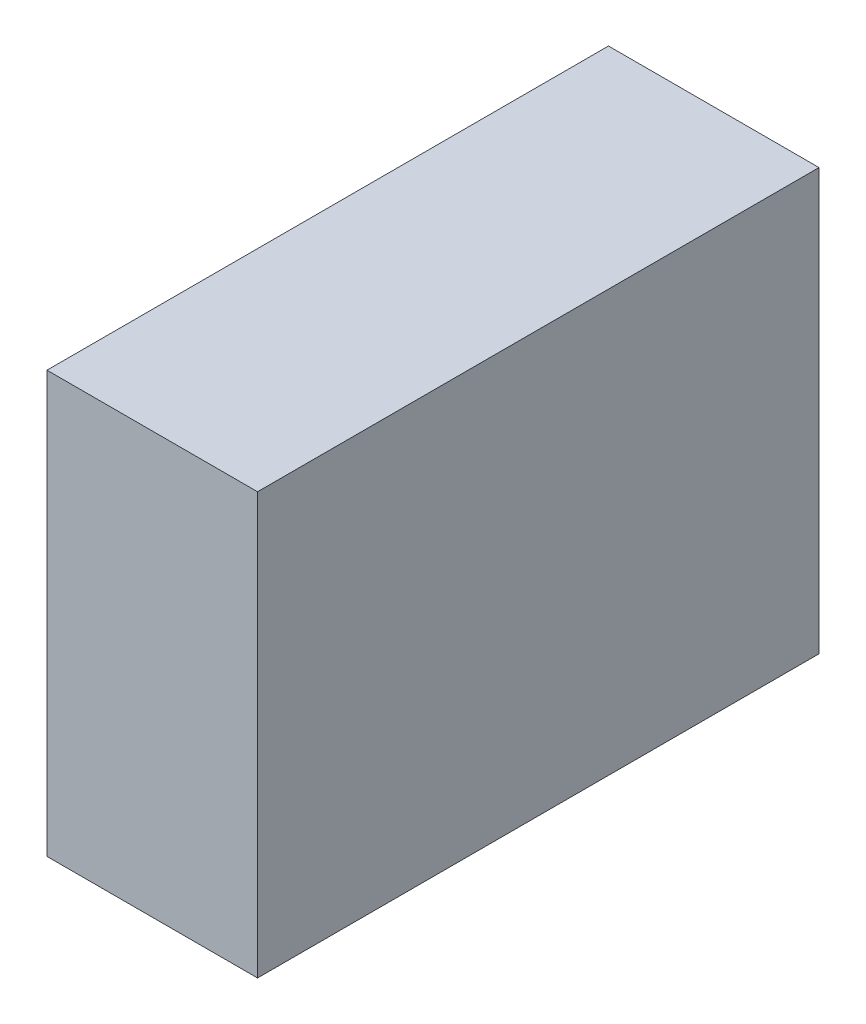
ISO-10303-21;
HEADER;
FILE_DESCRIPTION(('STEP AP214'),'2;1');
FILE_NAME('part.step','',(''),(''),'','','');
FILE_SCHEMA(('AUTOMOTIVE_DESIGN { 1 0 10303 214 1 1 1 1 }'));
ENDSEC;
DATA;
#1=APPLICATION_CONTEXT('core data for automotive mechanical design processes');
#2=APPLICATION_PROTOCOL_DEFINITION('international standard','automotive_design',2000,#1);
#3=PRODUCT_CONTEXT('',#1,'mechanical');
#4=PRODUCT('Part','Part','',(#3));
#5=PRODUCT_RELATED_PRODUCT_CATEGORY('part','',(#4));
#6=PRODUCT_DEFINITION_FORMATION('','',#4);
#7=PRODUCT_DEFINITION_CONTEXT('part definition',#1,'design');
#8=PRODUCT_DEFINITION('design','',#6,#7);
#9=PRODUCT_DEFINITION_SHAPE('','',#8);
#10=(LENGTH_UNIT() NAMED_UNIT(*) SI_UNIT(.MILLI.,.METRE.));
#11=(NAMED_UNIT(*) PLANE_ANGLE_UNIT() SI_UNIT($,.RADIAN.));
#12=(NAMED_UNIT(*) SI_UNIT($,.STERADIAN.) SOLID_ANGLE_UNIT());
#13=UNCERTAINTY_MEASURE_WITH_UNIT(LENGTH_MEASURE(1.E-05),#10,'distance_accuracy_value','');
#14=(GEOMETRIC_REPRESENTATION_CONTEXT(3) GLOBAL_UNCERTAINTY_ASSIGNED_CONTEXT((#13)) GLOBAL_UNIT_ASSIGNED_CONTEXT((#10,
#11,#12)) REPRESENTATION_CONTEXT('',''));
#15=CARTESIAN_POINT('',(0.,0.,0.));
#16=DIRECTION('',(0.,0.,1.));
#17=DIRECTION('',(1.,0.,0.));
#18=AXIS2_PLACEMENT_3D('',#15,#16,#17);
#19=CARTESIAN_POINT('',(0.,0.,152.4));
#20=DIRECTION('',(1.,0.,0.));
#21=DIRECTION('',(0.,1.,0.));
#22=AXIS2_PLACEMENT_3D('',#19,#20,#21);
#23=PLANE('',#22);
#24=DIRECTION('',(0.,-1.,0.));
#25=VECTOR('',#24,1.);
#26=CARTESIAN_POINT('',(0.,0.,0.));
#27=LINE('',#26,#25);
#28=CARTESIAN_POINT('',(0.,114.3,0.));
#29=VERTEX_POINT('',#28);
#30=CARTESIAN_POINT('',(0.,0.,0.));
#31=VERTEX_POINT('',#30);
#32=EDGE_CURVE('E100',#29,#31,#27,.T.);
#33=ORIENTED_EDGE('',*,*,#32,.T.);
#34=DIRECTION('',(0.,0.,-1.));
#35=VECTOR('',#34,1.);
#36=CARTESIAN_POINT('',(0.,0.,152.4));
#37=LINE('',#36,#35);
#38=CARTESIAN_POINT('',(0.,0.,152.4));
#39=VERTEX_POINT('',#38);
#40=EDGE_CURVE('E11',#39,#31,#37,.T.);
#41=ORIENTED_EDGE('',*,*,#40,.F.);
#42=DIRECTION('',(0.,-1.,0.));
#43=VECTOR('',#42,1.);
#44=CARTESIAN_POINT('',(0.,0.,152.4));
#45=LINE('',#44,#43);
#46=CARTESIAN_POINT('',(0.,114.3,152.4));
#47=VERTEX_POINT('',#46);
#48=EDGE_CURVE('E88',#47,#39,#45,.T.);
#49=ORIENTED_EDGE('',*,*,#48,.F.);
#50=DIRECTION('',(0.,0.,-1.));
#51=VECTOR('',#50,1.);
#52=CARTESIAN_POINT('',(0.,114.3,152.4));
#53=LINE('',#52,#51);
#54=EDGE_CURVE('E96',#47,#29,#53,.T.);
#55=ORIENTED_EDGE('',*,*,#54,.T.);
#56=EDGE_LOOP('',(#33,#41,#49,#55));
#57=FACE_BOUND('',#56,.T.);
#58=ADVANCED_FACE('F37',(#57),#23,.F.);
#59=CARTESIAN_POINT('',(0.,0.,152.4));
#60=DIRECTION('',(0.,1.,0.));
#61=DIRECTION('',(0.,0.,1.));
#62=AXIS2_PLACEMENT_3D('',#59,#60,#61);
#63=PLANE('',#62);
#64=DIRECTION('',(1.,0.,0.));
#65=VECTOR('',#64,1.);
#66=CARTESIAN_POINT('',(0.,0.,0.));
#67=LINE('',#66,#65);
#68=CARTESIAN_POINT('',(57.15,0.,0.));
#69=VERTEX_POINT('',#68);
#70=EDGE_CURVE('E92',#31,#69,#67,.T.);
#71=ORIENTED_EDGE('',*,*,#70,.T.);
#72=DIRECTION('',(0.,0.,-1.));
#73=VECTOR('',#72,1.);
#74=CARTESIAN_POINT('',(57.15,0.,152.4));
#75=LINE('',#74,#73);
#76=CARTESIAN_POINT('',(57.15,0.,152.4));
#77=VERTEX_POINT('',#76);
#78=EDGE_CURVE('E45',#77,#69,#75,.T.);
#79=ORIENTED_EDGE('',*,*,#78,.F.);
#80=DIRECTION('',(1.,0.,0.));
#81=VECTOR('',#80,1.);
#82=CARTESIAN_POINT('',(0.,0.,152.4));
#83=LINE('',#82,#81);
#84=EDGE_CURVE('E83',#39,#77,#83,.T.);
#85=ORIENTED_EDGE('',*,*,#84,.F.);
#86=ORIENTED_EDGE('',*,*,#40,.T.);
#87=EDGE_LOOP('',(#71,#79,#85,#86));
#88=FACE_BOUND('',#87,.T.);
#89=ADVANCED_FACE('F91',(#88),#63,.F.);
#90=CARTESIAN_POINT('',(57.15,0.,152.4));
#91=DIRECTION('',(-1.,0.,0.));
#92=DIRECTION('',(0.,-1.,0.));
#93=AXIS2_PLACEMENT_3D('',#90,#91,#92);
#94=PLANE('',#93);
#95=DIRECTION('',(0.,1.,0.));
#96=VECTOR('',#95,1.);
#97=CARTESIAN_POINT('',(57.15,0.,0.));
#98=LINE('',#97,#96);
#99=CARTESIAN_POINT('',(57.15,114.3,0.));
#100=VERTEX_POINT('',#99);
#101=EDGE_CURVE('E70',#69,#100,#98,.T.);
#102=ORIENTED_EDGE('',*,*,#101,.T.);
#103=DIRECTION('',(0.,0.,-1.));
#104=VECTOR('',#103,1.);
#105=CARTESIAN_POINT('',(57.15,114.3,152.4));
#106=LINE('',#105,#104);
#107=CARTESIAN_POINT('',(57.15,114.3,152.4));
#108=VERTEX_POINT('',#107);
#109=EDGE_CURVE('E93',#108,#100,#106,.T.);
#110=ORIENTED_EDGE('',*,*,#109,.F.);
#111=DIRECTION('',(0.,1.,0.));
#112=VECTOR('',#111,1.);
#113=CARTESIAN_POINT('',(57.15,0.,152.4));
#114=LINE('',#113,#112);
#115=EDGE_CURVE('E86',#77,#108,#114,.T.);
#116=ORIENTED_EDGE('',*,*,#115,.F.);
#117=ORIENTED_EDGE('',*,*,#78,.T.);
#118=EDGE_LOOP('',(#102,#110,#116,#117));
#119=FACE_BOUND('',#118,.T.);
#120=ADVANCED_FACE('F94',(#119),#94,.F.);
#121=CARTESIAN_POINT('',(0.,114.3,152.4));
#122=DIRECTION('',(0.,-1.,0.));
#123=DIRECTION('',(0.,0.,-1.));
#124=AXIS2_PLACEMENT_3D('',#121,#122,#123);
#125=PLANE('',#124);
#126=DIRECTION('',(-1.,0.,0.));
#127=VECTOR('',#126,1.);
#128=CARTESIAN_POINT('',(0.,114.3,0.));
#129=LINE('',#128,#127);
#130=EDGE_CURVE('E76',#100,#29,#129,.T.);
#131=ORIENTED_EDGE('',*,*,#130,.T.);
#132=ORIENTED_EDGE('',*,*,#54,.F.);
#133=DIRECTION('',(-1.,0.,0.));
#134=VECTOR('',#133,1.);
#135=CARTESIAN_POINT('',(0.,114.3,152.4));
#136=LINE('',#135,#134);
#137=EDGE_CURVE('E53',#108,#47,#136,.T.);
#138=ORIENTED_EDGE('',*,*,#137,.F.);
#139=ORIENTED_EDGE('',*,*,#109,.T.);
#140=EDGE_LOOP('',(#131,#132,#138,#139));
#141=FACE_BOUND('',#140,.T.);
#142=ADVANCED_FACE('F107',(#141),#125,.F.);
#143=CARTESIAN_POINT('',(0.,0.,152.4));
#144=DIRECTION('',(0.,0.,-1.));
#145=DIRECTION('',(-1.,0.,0.));
#146=AXIS2_PLACEMENT_3D('',#143,#144,#145);
#147=PLANE('',#146);
#148=ORIENTED_EDGE('',*,*,#48,.T.);
#149=ORIENTED_EDGE('',*,*,#84,.T.);
#150=ORIENTED_EDGE('',*,*,#115,.T.);
#151=ORIENTED_EDGE('',*,*,#137,.T.);
#152=EDGE_LOOP('',(#148,#149,#150,#151));
#153=FACE_BOUND('',#152,.T.);
#154=ADVANCED_FACE('F84',(#153),#147,.F.);
#155=CARTESIAN_POINT('',(0.,0.,0.));
#156=DIRECTION('',(0.,0.,-1.));
#157=DIRECTION('',(-1.,0.,0.));
#158=AXIS2_PLACEMENT_3D('',#155,#156,#157);
#159=PLANE('',#158);
#160=ORIENTED_EDGE('',*,*,#32,.F.);
#161=ORIENTED_EDGE('',*,*,#130,.F.);
#162=ORIENTED_EDGE('',*,*,#101,.F.);
#163=ORIENTED_EDGE('',*,*,#70,.F.);
#164=EDGE_LOOP('',(#160,#161,#162,#163));
#165=FACE_BOUND('',#164,.T.);
#166=ADVANCED_FACE('F110',(#165),#159,.T.);
#167=CLOSED_SHELL('',(#58,#89,#120,#142,#154,#166));
#168=MANIFOLD_SOLID_BREP('B2',#167);
#169=ADVANCED_BREP_SHAPE_REPRESENTATION('',(#18,#168),#14);
#170=SHAPE_DEFINITION_REPRESENTATION(#9,#169);
ENDSEC;
END-ISO-10303-21;
